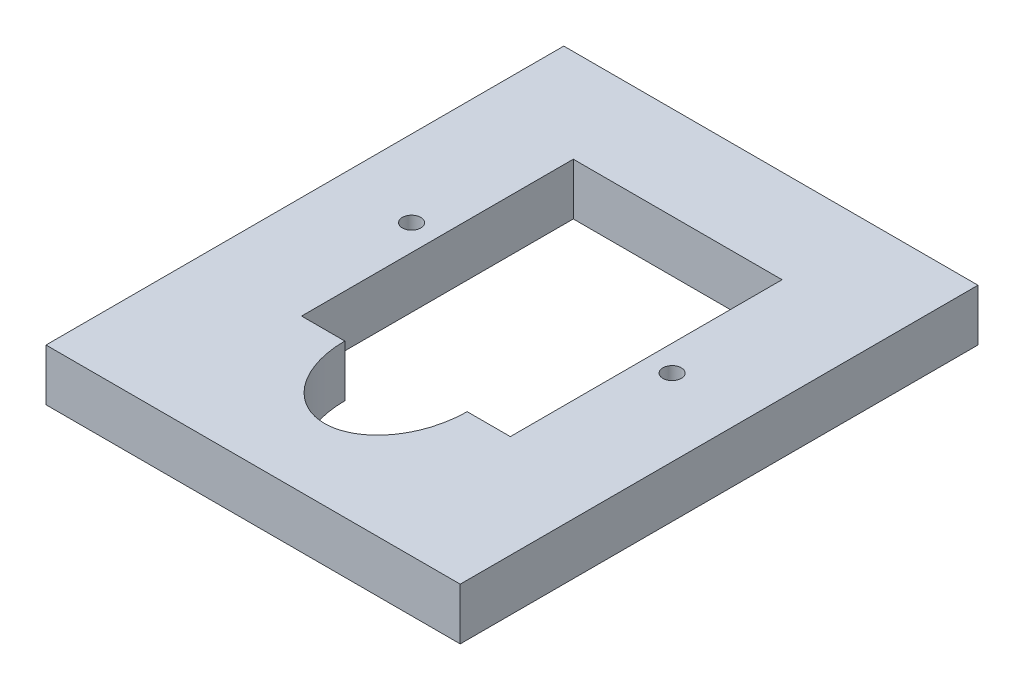
ISO-10303-21;
HEADER;
FILE_DESCRIPTION(('STEP AP214'),'2;1');
FILE_NAME('part.step','',(''),(''),'','','');
FILE_SCHEMA(('AUTOMOTIVE_DESIGN { 1 0 10303 214 1 1 1 1 }'));
ENDSEC;
DATA;
#1=APPLICATION_CONTEXT('core data for automotive mechanical design processes');
#2=APPLICATION_PROTOCOL_DEFINITION('international standard','automotive_design',2000,#1);
#3=PRODUCT_CONTEXT('',#1,'mechanical');
#4=PRODUCT('Part','Part','',(#3));
#5=PRODUCT_RELATED_PRODUCT_CATEGORY('part','',(#4));
#6=PRODUCT_DEFINITION_FORMATION('','',#4);
#7=PRODUCT_DEFINITION_CONTEXT('part definition',#1,'design');
#8=PRODUCT_DEFINITION('design','',#6,#7);
#9=PRODUCT_DEFINITION_SHAPE('','',#8);
#10=(LENGTH_UNIT() NAMED_UNIT(*) SI_UNIT(.MILLI.,.METRE.));
#11=(NAMED_UNIT(*) PLANE_ANGLE_UNIT() SI_UNIT($,.RADIAN.));
#12=(NAMED_UNIT(*) SI_UNIT($,.STERADIAN.) SOLID_ANGLE_UNIT());
#13=UNCERTAINTY_MEASURE_WITH_UNIT(LENGTH_MEASURE(1.E-05),#10,'distance_accuracy_value','');
#14=(GEOMETRIC_REPRESENTATION_CONTEXT(3) GLOBAL_UNCERTAINTY_ASSIGNED_CONTEXT((#13)) GLOBAL_UNIT_ASSIGNED_CONTEXT((#10,
#11,#12)) REPRESENTATION_CONTEXT('',''));
#15=CARTESIAN_POINT('',(0.,0.,0.));
#16=DIRECTION('',(0.,0.,1.));
#17=DIRECTION('',(1.,0.,0.));
#18=AXIS2_PLACEMENT_3D('',#15,#16,#17);
#19=CARTESIAN_POINT('',(0.,6.35,0.));
#20=DIRECTION('',(0.,1.,0.));
#21=DIRECTION('',(0.,0.,1.));
#22=AXIS2_PLACEMENT_3D('',#19,#20,#21);
#23=PLANE('',#22);
#24=CARTESIAN_POINT('',(37.7431381677544,6.35,-1.78835003718579));
#25=DIRECTION('',(0.,1.,0.));
#26=DIRECTION('',(0.,0.,1.));
#27=AXIS2_PLACEMENT_3D('',#24,#25,#26);
#28=CIRCLE('',#27,1.1303);
#29=CARTESIAN_POINT('',(37.7431381677544,6.35,-0.658050037185791));
#30=VERTEX_POINT('',#29);
#31=EDGE_CURVE('E233',#30,#30,#28,.T.);
#32=ORIENTED_EDGE('',*,*,#31,.F.);
#33=EDGE_LOOP('',(#32));
#34=FACE_BOUND('',#33,.T.);
#35=DIRECTION('',(0.,0.,1.));
#36=VECTOR('',#35,1.);
#37=CARTESIAN_POINT('',(-3.63346183224562,6.35,-29.8807500371858));
#38=LINE('',#37,#36);
#39=CARTESIAN_POINT('',(-3.63346183224562,6.35,-29.8807500371858));
#40=VERTEX_POINT('',#39);
#41=CARTESIAN_POINT('',(-3.63346183224562,6.35,33.6192499628142));
#42=VERTEX_POINT('',#41);
#43=EDGE_CURVE('E193',#40,#42,#38,.T.);
#44=ORIENTED_EDGE('',*,*,#43,.T.);
#45=DIRECTION('',(1.,0.,0.));
#46=VECTOR('',#45,1.);
#47=CARTESIAN_POINT('',(-3.63346183224562,6.35,33.6192499628142));
#48=LINE('',#47,#46);
#49=CARTESIAN_POINT('',(47.1665381677544,6.35,33.6192499628142));
#50=VERTEX_POINT('',#49);
#51=EDGE_CURVE('E207',#42,#50,#48,.T.);
#52=ORIENTED_EDGE('',*,*,#51,.T.);
#53=DIRECTION('',(0.,0.,-1.));
#54=VECTOR('',#53,1.);
#55=CARTESIAN_POINT('',(47.1665381677544,6.35,-29.8807500371858));
#56=LINE('',#55,#54);
#57=CARTESIAN_POINT('',(47.1665381677544,6.35,-29.8807500371858));
#58=VERTEX_POINT('',#57);
#59=EDGE_CURVE('E187',#50,#58,#56,.T.);
#60=ORIENTED_EDGE('',*,*,#59,.T.);
#61=DIRECTION('',(-1.,0.,0.));
#62=VECTOR('',#61,1.);
#63=CARTESIAN_POINT('',(-3.63346183224562,6.35,-29.8807500371858));
#64=LINE('',#63,#62);
#65=EDGE_CURVE('E200',#58,#40,#64,.T.);
#66=ORIENTED_EDGE('',*,*,#65,.T.);
#67=EDGE_LOOP('',(#44,#52,#60,#66));
#68=FACE_BOUND('',#67,.T.);
#69=DIRECTION('',(1.,0.,0.));
#70=VECTOR('',#69,1.);
#71=CARTESIAN_POINT('',(8.96493816775438,6.35,14.8740499628142));
#72=LINE('',#71,#70);
#73=CARTESIAN_POINT('',(8.96493816775438,6.35,14.8740499628142));
#74=VERTEX_POINT('',#73);
#75=CARTESIAN_POINT('',(14.2665381677544,6.35,14.8740499628142));
#76=VERTEX_POINT('',#75);
#77=EDGE_CURVE('E120',#74,#76,#72,.T.);
#78=ORIENTED_EDGE('',*,*,#77,.F.);
#79=DIRECTION('',(0.,0.,1.));
#80=VECTOR('',#79,1.);
#81=CARTESIAN_POINT('',(8.96493816775438,6.35,-18.4507500371858));
#82=LINE('',#81,#80);
#83=CARTESIAN_POINT('',(8.96493816775438,6.35,-18.4507500371858));
#84=VERTEX_POINT('',#83);
#85=EDGE_CURVE('E112',#84,#74,#82,.T.);
#86=ORIENTED_EDGE('',*,*,#85,.F.);
#87=DIRECTION('',(-1.,0.,0.));
#88=VECTOR('',#87,1.);
#89=CARTESIAN_POINT('',(8.96493816775438,6.35,-18.4507500371858));
#90=LINE('',#89,#88);
#91=CARTESIAN_POINT('',(34.5681381677544,6.35,-18.4507500371858));
#92=VERTEX_POINT('',#91);
#93=EDGE_CURVE('E219',#92,#84,#90,.T.);
#94=ORIENTED_EDGE('',*,*,#93,.F.);
#95=DIRECTION('',(0.,0.,-1.));
#96=VECTOR('',#95,1.);
#97=CARTESIAN_POINT('',(34.5681381677544,6.35,-18.4507500371858));
#98=LINE('',#97,#96);
#99=CARTESIAN_POINT('',(34.5681381677544,6.35,14.8740499628142));
#100=VERTEX_POINT('',#99);
#101=EDGE_CURVE('E234',#100,#92,#98,.T.);
#102=ORIENTED_EDGE('',*,*,#101,.F.);
#103=DIRECTION('',(1.,0.,0.));
#104=VECTOR('',#103,1.);
#105=CARTESIAN_POINT('',(29.2665381677544,6.35,14.8740499628142));
#106=LINE('',#105,#104);
#107=CARTESIAN_POINT('',(29.2665381677544,6.35,14.8740499628142));
#108=VERTEX_POINT('',#107);
#109=EDGE_CURVE('E136',#108,#100,#106,.T.);
#110=ORIENTED_EDGE('',*,*,#109,.F.);
#111=CARTESIAN_POINT('',(21.7665381677544,6.35,14.8740499628142));
#112=DIRECTION('',(0.,1.,0.));
#113=DIRECTION('',(0.,0.,-1.));
#114=AXIS2_PLACEMENT_3D('',#111,#112,#113);
#115=ELLIPSE('',#114,10.,7.5);
#116=EDGE_CURVE('E134',#76,#108,#115,.T.);
#117=ORIENTED_EDGE('',*,*,#116,.F.);
#118=EDGE_LOOP('',(#78,#86,#94,#102,#110,#117));
#119=FACE_BOUND('',#118,.T.);
#120=CARTESIAN_POINT('',(5.78993816775438,6.35,-1.78835003718579));
#121=DIRECTION('',(0.,1.,0.));
#122=DIRECTION('',(0.,0.,1.));
#123=AXIS2_PLACEMENT_3D('',#120,#121,#122);
#124=CIRCLE('',#123,1.1303);
#125=CARTESIAN_POINT('',(5.78993816775438,6.35,-0.658050037185794));
#126=VERTEX_POINT('',#125);
#127=EDGE_CURVE('E254',#126,#126,#124,.T.);
#128=ORIENTED_EDGE('',*,*,#127,.F.);
#129=EDGE_LOOP('',(#128));
#130=FACE_BOUND('',#129,.T.);
#131=ADVANCED_FACE('F35',(#34,#68,#119,#130),#23,.T.);
#132=CARTESIAN_POINT('',(0.,0.,0.));
#133=DIRECTION('',(0.,1.,0.));
#134=DIRECTION('',(0.,0.,1.));
#135=AXIS2_PLACEMENT_3D('',#132,#133,#134);
#136=PLANE('',#135);
#137=DIRECTION('',(0.,0.,1.));
#138=VECTOR('',#137,1.);
#139=CARTESIAN_POINT('',(-3.63346183224562,0.,-29.8807500371858));
#140=LINE('',#139,#138);
#141=CARTESIAN_POINT('',(-3.63346183224562,0.,-29.8807500371858));
#142=VERTEX_POINT('',#141);
#143=CARTESIAN_POINT('',(-3.63346183224562,0.,33.6192499628142));
#144=VERTEX_POINT('',#143);
#145=EDGE_CURVE('E128',#142,#144,#140,.T.);
#146=ORIENTED_EDGE('',*,*,#145,.F.);
#147=DIRECTION('',(-1.,0.,0.));
#148=VECTOR('',#147,1.);
#149=CARTESIAN_POINT('',(-3.63346183224562,0.,-29.8807500371858));
#150=LINE('',#149,#148);
#151=CARTESIAN_POINT('',(47.1665381677544,0.,-29.8807500371858));
#152=VERTEX_POINT('',#151);
#153=EDGE_CURVE('E191',#152,#142,#150,.T.);
#154=ORIENTED_EDGE('',*,*,#153,.F.);
#155=DIRECTION('',(0.,0.,-1.));
#156=VECTOR('',#155,1.);
#157=CARTESIAN_POINT('',(47.1665381677544,0.,-29.8807500371858));
#158=LINE('',#157,#156);
#159=CARTESIAN_POINT('',(47.1665381677544,0.,33.6192499628142));
#160=VERTEX_POINT('',#159);
#161=EDGE_CURVE('E183',#160,#152,#158,.T.);
#162=ORIENTED_EDGE('',*,*,#161,.F.);
#163=DIRECTION('',(1.,0.,0.));
#164=VECTOR('',#163,1.);
#165=CARTESIAN_POINT('',(-3.63346183224562,0.,33.6192499628142));
#166=LINE('',#165,#164);
#167=EDGE_CURVE('E176',#144,#160,#166,.T.);
#168=ORIENTED_EDGE('',*,*,#167,.F.);
#169=EDGE_LOOP('',(#146,#154,#162,#168));
#170=FACE_BOUND('',#169,.T.);
#171=DIRECTION('',(0.,0.,1.));
#172=VECTOR('',#171,1.);
#173=CARTESIAN_POINT('',(8.96493816775438,0.,-18.4507500371858));
#174=LINE('',#173,#172);
#175=CARTESIAN_POINT('',(8.96493816775438,0.,-18.4507500371858));
#176=VERTEX_POINT('',#175);
#177=CARTESIAN_POINT('',(8.96493816775438,0.,14.8740499628142));
#178=VERTEX_POINT('',#177);
#179=EDGE_CURVE('E58',#176,#178,#174,.T.);
#180=ORIENTED_EDGE('',*,*,#179,.T.);
#181=DIRECTION('',(1.,0.,0.));
#182=VECTOR('',#181,1.);
#183=CARTESIAN_POINT('',(8.96493816775438,0.,14.8740499628142));
#184=LINE('',#183,#182);
#185=CARTESIAN_POINT('',(14.2665381677544,0.,14.8740499628142));
#186=VERTEX_POINT('',#185);
#187=EDGE_CURVE('E127',#178,#186,#184,.T.);
#188=ORIENTED_EDGE('',*,*,#187,.T.);
#189=CARTESIAN_POINT('',(21.7665381677544,0.,14.8740499628142));
#190=DIRECTION('',(0.,1.,0.));
#191=DIRECTION('',(0.,0.,-1.));
#192=AXIS2_PLACEMENT_3D('',#189,#190,#191);
#193=ELLIPSE('',#192,10.,7.5);
#194=CARTESIAN_POINT('',(29.2665381677544,0.,14.8740499628142));
#195=VERTEX_POINT('',#194);
#196=EDGE_CURVE('E228',#186,#195,#193,.T.);
#197=ORIENTED_EDGE('',*,*,#196,.T.);
#198=DIRECTION('',(1.,0.,0.));
#199=VECTOR('',#198,1.);
#200=CARTESIAN_POINT('',(29.2665381677544,0.,14.8740499628142));
#201=LINE('',#200,#199);
#202=CARTESIAN_POINT('',(34.5681381677544,0.,14.8740499628142));
#203=VERTEX_POINT('',#202);
#204=EDGE_CURVE('E225',#195,#203,#201,.T.);
#205=ORIENTED_EDGE('',*,*,#204,.T.);
#206=DIRECTION('',(0.,0.,-1.));
#207=VECTOR('',#206,1.);
#208=CARTESIAN_POINT('',(34.5681381677544,0.,-18.4507500371858));
#209=LINE('',#208,#207);
#210=CARTESIAN_POINT('',(34.5681381677544,0.,-18.4507500371858));
#211=VERTEX_POINT('',#210);
#212=EDGE_CURVE('E222',#203,#211,#209,.T.);
#213=ORIENTED_EDGE('',*,*,#212,.T.);
#214=DIRECTION('',(-1.,0.,0.));
#215=VECTOR('',#214,1.);
#216=CARTESIAN_POINT('',(8.96493816775438,0.,-18.4507500371858));
#217=LINE('',#216,#215);
#218=EDGE_CURVE('E121',#211,#176,#217,.T.);
#219=ORIENTED_EDGE('',*,*,#218,.T.);
#220=EDGE_LOOP('',(#180,#188,#197,#205,#213,#219));
#221=FACE_BOUND('',#220,.T.);
#222=CARTESIAN_POINT('',(37.7431381677544,0.,-1.78835003718579));
#223=DIRECTION('',(0.,1.,0.));
#224=DIRECTION('',(0.,0.,1.));
#225=AXIS2_PLACEMENT_3D('',#222,#223,#224);
#226=CIRCLE('',#225,1.1303);
#227=CARTESIAN_POINT('',(37.7431381677544,0.,-0.658050037185791));
#228=VERTEX_POINT('',#227);
#229=EDGE_CURVE('E249',#228,#228,#226,.T.);
#230=ORIENTED_EDGE('',*,*,#229,.T.);
#231=EDGE_LOOP('',(#230));
#232=FACE_BOUND('',#231,.T.);
#233=CARTESIAN_POINT('',(5.78993816775438,0.,-1.78835003718579));
#234=DIRECTION('',(0.,1.,0.));
#235=DIRECTION('',(0.,0.,1.));
#236=AXIS2_PLACEMENT_3D('',#233,#234,#235);
#237=CIRCLE('',#236,1.1303);
#238=CARTESIAN_POINT('',(5.78993816775438,0.,-0.658050037185794));
#239=VERTEX_POINT('',#238);
#240=EDGE_CURVE('E252',#239,#239,#237,.T.);
#241=ORIENTED_EDGE('',*,*,#240,.T.);
#242=EDGE_LOOP('',(#241));
#243=FACE_BOUND('',#242,.T.);
#244=ADVANCED_FACE('F157',(#170,#221,#232,#243),#136,.F.);
#245=CARTESIAN_POINT('',(-3.63346183224562,6.35,-29.8807500371858));
#246=DIRECTION('',(1.,0.,0.));
#247=DIRECTION('',(0.,0.,-1.));
#248=AXIS2_PLACEMENT_3D('',#245,#246,#247);
#249=PLANE('',#248);
#250=ORIENTED_EDGE('',*,*,#145,.T.);
#251=DIRECTION('',(0.,-1.,0.));
#252=VECTOR('',#251,1.);
#253=CARTESIAN_POINT('',(-3.63346183224562,6.35,33.6192499628142));
#254=LINE('',#253,#252);
#255=EDGE_CURVE('E11',#42,#144,#254,.T.);
#256=ORIENTED_EDGE('',*,*,#255,.F.);
#257=ORIENTED_EDGE('',*,*,#43,.F.);
#258=DIRECTION('',(0.,-1.,0.));
#259=VECTOR('',#258,1.);
#260=CARTESIAN_POINT('',(-3.63346183224562,6.35,-29.8807500371858));
#261=LINE('',#260,#259);
#262=EDGE_CURVE('E197',#40,#142,#261,.T.);
#263=ORIENTED_EDGE('',*,*,#262,.T.);
#264=EDGE_LOOP('',(#250,#256,#257,#263));
#265=FACE_BOUND('',#264,.T.);
#266=ADVANCED_FACE('F37',(#265),#249,.F.);
#267=CARTESIAN_POINT('',(-3.63346183224562,6.35,33.6192499628142));
#268=DIRECTION('',(0.,0.,-1.));
#269=DIRECTION('',(-1.,0.,0.));
#270=AXIS2_PLACEMENT_3D('',#267,#268,#269);
#271=PLANE('',#270);
#272=ORIENTED_EDGE('',*,*,#167,.T.);
#273=DIRECTION('',(0.,-1.,0.));
#274=VECTOR('',#273,1.);
#275=CARTESIAN_POINT('',(47.1665381677544,6.35,33.6192499628142));
#276=LINE('',#275,#274);
#277=EDGE_CURVE('E43',#50,#160,#276,.T.);
#278=ORIENTED_EDGE('',*,*,#277,.F.);
#279=ORIENTED_EDGE('',*,*,#51,.F.);
#280=ORIENTED_EDGE('',*,*,#255,.T.);
#281=EDGE_LOOP('',(#272,#278,#279,#280));
#282=FACE_BOUND('',#281,.T.);
#283=ADVANCED_FACE('F167',(#282),#271,.F.);
#284=CARTESIAN_POINT('',(47.1665381677544,6.35,-29.8807500371858));
#285=DIRECTION('',(-1.,0.,0.));
#286=DIRECTION('',(0.,0.,1.));
#287=AXIS2_PLACEMENT_3D('',#284,#285,#286);
#288=PLANE('',#287);
#289=ORIENTED_EDGE('',*,*,#161,.T.);
#290=DIRECTION('',(0.,-1.,0.));
#291=VECTOR('',#290,1.);
#292=CARTESIAN_POINT('',(47.1665381677544,6.35,-29.8807500371858));
#293=LINE('',#292,#291);
#294=EDGE_CURVE('E188',#58,#152,#293,.T.);
#295=ORIENTED_EDGE('',*,*,#294,.F.);
#296=ORIENTED_EDGE('',*,*,#59,.F.);
#297=ORIENTED_EDGE('',*,*,#277,.T.);
#298=EDGE_LOOP('',(#289,#295,#296,#297));
#299=FACE_BOUND('',#298,.T.);
#300=ADVANCED_FACE('F164',(#299),#288,.F.);
#301=CARTESIAN_POINT('',(-3.63346183224562,6.35,-29.8807500371858));
#302=DIRECTION('',(0.,0.,1.));
#303=DIRECTION('',(1.,0.,0.));
#304=AXIS2_PLACEMENT_3D('',#301,#302,#303);
#305=PLANE('',#304);
#306=ORIENTED_EDGE('',*,*,#153,.T.);
#307=ORIENTED_EDGE('',*,*,#262,.F.);
#308=ORIENTED_EDGE('',*,*,#65,.F.);
#309=ORIENTED_EDGE('',*,*,#294,.T.);
#310=EDGE_LOOP('',(#306,#307,#308,#309));
#311=FACE_BOUND('',#310,.T.);
#312=ADVANCED_FACE('F154',(#311),#305,.F.);
#313=CARTESIAN_POINT('',(8.96493816775438,6.35,-18.4507500371858));
#314=DIRECTION('',(1.,0.,0.));
#315=DIRECTION('',(0.,0.,-1.));
#316=AXIS2_PLACEMENT_3D('',#313,#314,#315);
#317=PLANE('',#316);
#318=ORIENTED_EDGE('',*,*,#179,.F.);
#319=DIRECTION('',(0.,-1.,0.));
#320=VECTOR('',#319,1.);
#321=CARTESIAN_POINT('',(8.96493816775438,6.35,-18.4507500371858));
#322=LINE('',#321,#320);
#323=EDGE_CURVE('E116',#84,#176,#322,.T.);
#324=ORIENTED_EDGE('',*,*,#323,.F.);
#325=ORIENTED_EDGE('',*,*,#85,.T.);
#326=DIRECTION('',(0.,-1.,0.));
#327=VECTOR('',#326,1.);
#328=CARTESIAN_POINT('',(8.96493816775438,6.35,14.8740499628142));
#329=LINE('',#328,#327);
#330=EDGE_CURVE('E115',#74,#178,#329,.T.);
#331=ORIENTED_EDGE('',*,*,#330,.T.);
#332=EDGE_LOOP('',(#318,#324,#325,#331));
#333=FACE_BOUND('',#332,.T.);
#334=ADVANCED_FACE('F114',(#333),#317,.T.);
#335=CARTESIAN_POINT('',(8.96493816775438,6.35,14.8740499628142));
#336=DIRECTION('',(0.,0.,-1.));
#337=DIRECTION('',(-1.,0.,0.));
#338=AXIS2_PLACEMENT_3D('',#335,#336,#337);
#339=PLANE('',#338);
#340=ORIENTED_EDGE('',*,*,#187,.F.);
#341=ORIENTED_EDGE('',*,*,#330,.F.);
#342=ORIENTED_EDGE('',*,*,#77,.T.);
#343=DIRECTION('',(0.,-1.,0.));
#344=VECTOR('',#343,1.);
#345=CARTESIAN_POINT('',(14.2665381677544,6.35,14.8740499628142));
#346=LINE('',#345,#344);
#347=EDGE_CURVE('E129',#76,#186,#346,.T.);
#348=ORIENTED_EDGE('',*,*,#347,.T.);
#349=EDGE_LOOP('',(#340,#341,#342,#348));
#350=FACE_BOUND('',#349,.T.);
#351=ADVANCED_FACE('F124',(#350),#339,.T.);
#352=DIRECTION('',(0.,-1.,0.));
#353=VECTOR('',#352,1.);
#354=SURFACE_OF_LINEAR_EXTRUSION('',#115,#353);
#355=ORIENTED_EDGE('',*,*,#196,.F.);
#356=ORIENTED_EDGE('',*,*,#347,.F.);
#357=ORIENTED_EDGE('',*,*,#116,.T.);
#358=DIRECTION('',(0.,-1.,0.));
#359=VECTOR('',#358,1.);
#360=CARTESIAN_POINT('',(29.2665381677544,6.35,14.8740499628142));
#361=LINE('',#360,#359);
#362=EDGE_CURVE('E213',#108,#195,#361,.T.);
#363=ORIENTED_EDGE('',*,*,#362,.T.);
#364=EDGE_LOOP('',(#355,#356,#357,#363));
#365=FACE_BOUND('',#364,.T.);
#366=ADVANCED_FACE('F143',(#365),#354,.T.);
#367=CARTESIAN_POINT('',(29.2665381677544,6.35,14.8740499628142));
#368=DIRECTION('',(0.,0.,-1.));
#369=DIRECTION('',(-1.,0.,0.));
#370=AXIS2_PLACEMENT_3D('',#367,#368,#369);
#371=PLANE('',#370);
#372=ORIENTED_EDGE('',*,*,#204,.F.);
#373=ORIENTED_EDGE('',*,*,#362,.F.);
#374=ORIENTED_EDGE('',*,*,#109,.T.);
#375=DIRECTION('',(0.,-1.,0.));
#376=VECTOR('',#375,1.);
#377=CARTESIAN_POINT('',(34.5681381677544,6.35,14.8740499628142));
#378=LINE('',#377,#376);
#379=EDGE_CURVE('E215',#100,#203,#378,.T.);
#380=ORIENTED_EDGE('',*,*,#379,.T.);
#381=EDGE_LOOP('',(#372,#373,#374,#380));
#382=FACE_BOUND('',#381,.T.);
#383=ADVANCED_FACE('F147',(#382),#371,.T.);
#384=CARTESIAN_POINT('',(34.5681381677544,6.35,-18.4507500371858));
#385=DIRECTION('',(-1.,0.,0.));
#386=DIRECTION('',(0.,0.,1.));
#387=AXIS2_PLACEMENT_3D('',#384,#385,#386);
#388=PLANE('',#387);
#389=ORIENTED_EDGE('',*,*,#212,.F.);
#390=ORIENTED_EDGE('',*,*,#379,.F.);
#391=ORIENTED_EDGE('',*,*,#101,.T.);
#392=DIRECTION('',(0.,-1.,0.));
#393=VECTOR('',#392,1.);
#394=CARTESIAN_POINT('',(34.5681381677544,6.35,-18.4507500371858));
#395=LINE('',#394,#393);
#396=EDGE_CURVE('E50',#92,#211,#395,.T.);
#397=ORIENTED_EDGE('',*,*,#396,.T.);
#398=EDGE_LOOP('',(#389,#390,#391,#397));
#399=FACE_BOUND('',#398,.T.);
#400=ADVANCED_FACE('F242',(#399),#388,.T.);
#401=CARTESIAN_POINT('',(8.96493816775438,6.35,-18.4507500371858));
#402=DIRECTION('',(0.,0.,1.));
#403=DIRECTION('',(1.,0.,0.));
#404=AXIS2_PLACEMENT_3D('',#401,#402,#403);
#405=PLANE('',#404);
#406=ORIENTED_EDGE('',*,*,#218,.F.);
#407=ORIENTED_EDGE('',*,*,#396,.F.);
#408=ORIENTED_EDGE('',*,*,#93,.T.);
#409=ORIENTED_EDGE('',*,*,#323,.T.);
#410=EDGE_LOOP('',(#406,#407,#408,#409));
#411=FACE_BOUND('',#410,.T.);
#412=ADVANCED_FACE('F243',(#411),#405,.T.);
#413=CARTESIAN_POINT('',(37.7431381677544,6.35,-1.78835003718579));
#414=DIRECTION('',(0.,-1.,0.));
#415=DIRECTION('',(0.,0.,-1.));
#416=AXIS2_PLACEMENT_3D('',#413,#414,#415);
#417=CYLINDRICAL_SURFACE('',#416,1.1303);
#418=ORIENTED_EDGE('',*,*,#31,.T.);
#419=EDGE_LOOP('',(#418));
#420=FACE_BOUND('',#419,.T.);
#421=ORIENTED_EDGE('',*,*,#229,.F.);
#422=EDGE_LOOP('',(#421));
#423=FACE_BOUND('',#422,.T.);
#424=ADVANCED_FACE('F262',(#420,#423),#417,.F.);
#425=CARTESIAN_POINT('',(5.78993816775438,6.35,-1.78835003718579));
#426=DIRECTION('',(0.,-1.,0.));
#427=DIRECTION('',(0.,0.,-1.));
#428=AXIS2_PLACEMENT_3D('',#425,#426,#427);
#429=CYLINDRICAL_SURFACE('',#428,1.1303);
#430=ORIENTED_EDGE('',*,*,#127,.T.);
#431=EDGE_LOOP('',(#430));
#432=FACE_BOUND('',#431,.T.);
#433=ORIENTED_EDGE('',*,*,#240,.F.);
#434=EDGE_LOOP('',(#433));
#435=FACE_BOUND('',#434,.T.);
#436=ADVANCED_FACE('F265',(#432,#435),#429,.F.);
#437=CLOSED_SHELL('',(#131,#244,#266,#283,#300,#312,#334,#351,#366,#383,#400,#412,#424,#436));
#438=MANIFOLD_SOLID_BREP('B2',#437);
#439=ADVANCED_BREP_SHAPE_REPRESENTATION('',(#18,#438),#14);
#440=SHAPE_DEFINITION_REPRESENTATION(#9,#439);
ENDSEC;
END-ISO-10303-21;
